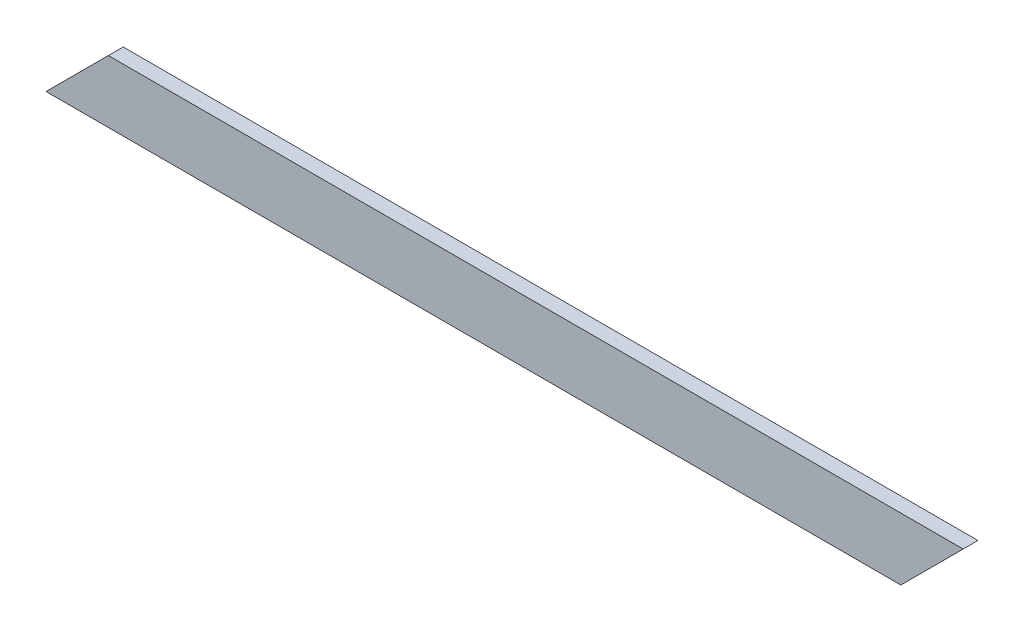
ISO-10303-21;
HEADER;
FILE_DESCRIPTION(('STEP AP214'),'2;1');
FILE_NAME('part.step','',(''),(''),'','','');
FILE_SCHEMA(('AUTOMOTIVE_DESIGN { 1 0 10303 214 1 1 1 1 }'));
ENDSEC;
DATA;
#1=APPLICATION_CONTEXT('core data for automotive mechanical design processes');
#2=APPLICATION_PROTOCOL_DEFINITION('international standard','automotive_design',2000,#1);
#3=PRODUCT_CONTEXT('',#1,'mechanical');
#4=PRODUCT('Part','Part','',(#3));
#5=PRODUCT_RELATED_PRODUCT_CATEGORY('part','',(#4));
#6=PRODUCT_DEFINITION_FORMATION('','',#4);
#7=PRODUCT_DEFINITION_CONTEXT('part definition',#1,'design');
#8=PRODUCT_DEFINITION('design','',#6,#7);
#9=PRODUCT_DEFINITION_SHAPE('','',#8);
#10=(LENGTH_UNIT() NAMED_UNIT(*) SI_UNIT(.MILLI.,.METRE.));
#11=(NAMED_UNIT(*) PLANE_ANGLE_UNIT() SI_UNIT($,.RADIAN.));
#12=(NAMED_UNIT(*) SI_UNIT($,.STERADIAN.) SOLID_ANGLE_UNIT());
#13=UNCERTAINTY_MEASURE_WITH_UNIT(LENGTH_MEASURE(1.E-05),#10,'distance_accuracy_value','');
#14=(GEOMETRIC_REPRESENTATION_CONTEXT(3) GLOBAL_UNCERTAINTY_ASSIGNED_CONTEXT((#13)) GLOBAL_UNIT_ASSIGNED_CONTEXT((#10,
#11,#12)) REPRESENTATION_CONTEXT('',''));
#15=CARTESIAN_POINT('',(0.,0.,0.));
#16=DIRECTION('',(0.,0.,1.));
#17=DIRECTION('',(1.,0.,0.));
#18=AXIS2_PLACEMENT_3D('',#15,#16,#17);
#19=CARTESIAN_POINT('',(266.699999911679,266.699999911679,63.5));
#20=DIRECTION('',(0.707106781186547,-0.707106781186548,0.));
#21=DIRECTION('',(0.707106781186548,0.707106781186547,0.));
#22=AXIS2_PLACEMENT_3D('',#19,#20,#21);
#23=PLANE('',#22);
#24=DIRECTION('',(-0.707106781186548,-0.707106781186547,0.));
#25=VECTOR('',#24,1.);
#26=CARTESIAN_POINT('',(266.699999911679,266.699999911679,0.));
#27=LINE('',#26,#25);
#28=CARTESIAN_POINT('',(266.699999911679,266.699999911679,0.));
#29=VERTEX_POINT('',#28);
#30=CARTESIAN_POINT('',(0.,0.,0.));
#31=VERTEX_POINT('',#30);
#32=EDGE_CURVE('E95',#29,#31,#27,.T.);
#33=ORIENTED_EDGE('',*,*,#32,.T.);
#34=DIRECTION('',(0.,0.,-1.));
#35=VECTOR('',#34,1.);
#36=CARTESIAN_POINT('',(0.,0.,63.5));
#37=LINE('',#36,#35);
#38=CARTESIAN_POINT('',(0.,0.,63.5));
#39=VERTEX_POINT('',#38);
#40=EDGE_CURVE('E11',#39,#31,#37,.T.);
#41=ORIENTED_EDGE('',*,*,#40,.F.);
#42=DIRECTION('',(-0.707106781186548,-0.707106781186547,0.));
#43=VECTOR('',#42,1.);
#44=CARTESIAN_POINT('',(266.699999911679,266.699999911679,63.5));
#45=LINE('',#44,#43);
#46=CARTESIAN_POINT('',(266.699999911679,266.699999911679,63.5));
#47=VERTEX_POINT('',#46);
#48=EDGE_CURVE('E83',#47,#39,#45,.T.);
#49=ORIENTED_EDGE('',*,*,#48,.F.);
#50=DIRECTION('',(0.,0.,-1.));
#51=VECTOR('',#50,1.);
#52=CARTESIAN_POINT('',(266.699999911679,266.699999911679,63.5));
#53=LINE('',#52,#51);
#54=EDGE_CURVE('E91',#47,#29,#53,.T.);
#55=ORIENTED_EDGE('',*,*,#54,.T.);
#56=EDGE_LOOP('',(#33,#41,#49,#55));
#57=FACE_BOUND('',#56,.T.);
#58=ADVANCED_FACE('F32',(#57),#23,.F.);
#59=CARTESIAN_POINT('',(0.,0.,63.5));
#60=DIRECTION('',(0.,1.,0.));
#61=DIRECTION('',(0.,0.,1.));
#62=AXIS2_PLACEMENT_3D('',#59,#60,#61);
#63=PLANE('',#62);
#64=DIRECTION('',(1.,0.,0.));
#65=VECTOR('',#64,1.);
#66=CARTESIAN_POINT('',(0.,0.,0.));
#67=LINE('',#66,#65);
#68=CARTESIAN_POINT('',(3657.6,0.,0.));
#69=VERTEX_POINT('',#68);
#70=EDGE_CURVE('E87',#31,#69,#67,.T.);
#71=ORIENTED_EDGE('',*,*,#70,.T.);
#72=DIRECTION('',(0.,0.,-1.));
#73=VECTOR('',#72,1.);
#74=CARTESIAN_POINT('',(3657.6,0.,63.5));
#75=LINE('',#74,#73);
#76=CARTESIAN_POINT('',(3657.6,0.,63.5));
#77=VERTEX_POINT('',#76);
#78=EDGE_CURVE('E40',#77,#69,#75,.T.);
#79=ORIENTED_EDGE('',*,*,#78,.F.);
#80=DIRECTION('',(1.,0.,0.));
#81=VECTOR('',#80,1.);
#82=CARTESIAN_POINT('',(0.,0.,63.5));
#83=LINE('',#82,#81);
#84=EDGE_CURVE('E78',#39,#77,#83,.T.);
#85=ORIENTED_EDGE('',*,*,#84,.F.);
#86=ORIENTED_EDGE('',*,*,#40,.T.);
#87=EDGE_LOOP('',(#71,#79,#85,#86));
#88=FACE_BOUND('',#87,.T.);
#89=ADVANCED_FACE('F86',(#88),#63,.F.);
#90=CARTESIAN_POINT('',(3657.6,0.,63.5));
#91=DIRECTION('',(-0.707106781186548,0.707106781186547,0.));
#92=DIRECTION('',(-0.707106781186547,-0.707106781186548,0.));
#93=AXIS2_PLACEMENT_3D('',#90,#91,#92);
#94=PLANE('',#93);
#95=DIRECTION('',(0.707106781186547,0.707106781186548,0.));
#96=VECTOR('',#95,1.);
#97=CARTESIAN_POINT('',(3657.6,0.,0.));
#98=LINE('',#97,#96);
#99=CARTESIAN_POINT('',(3924.29999991168,266.699999911679,0.));
#100=VERTEX_POINT('',#99);
#101=EDGE_CURVE('E65',#69,#100,#98,.T.);
#102=ORIENTED_EDGE('',*,*,#101,.T.);
#103=DIRECTION('',(0.,0.,-1.));
#104=VECTOR('',#103,1.);
#105=CARTESIAN_POINT('',(3924.29999991168,266.699999911679,63.5));
#106=LINE('',#105,#104);
#107=CARTESIAN_POINT('',(3924.29999991168,266.699999911679,63.5));
#108=VERTEX_POINT('',#107);
#109=EDGE_CURVE('E88',#108,#100,#106,.T.);
#110=ORIENTED_EDGE('',*,*,#109,.F.);
#111=DIRECTION('',(0.707106781186547,0.707106781186548,0.));
#112=VECTOR('',#111,1.);
#113=CARTESIAN_POINT('',(3657.6,0.,63.5));
#114=LINE('',#113,#112);
#115=EDGE_CURVE('E81',#77,#108,#114,.T.);
#116=ORIENTED_EDGE('',*,*,#115,.F.);
#117=ORIENTED_EDGE('',*,*,#78,.T.);
#118=EDGE_LOOP('',(#102,#110,#116,#117));
#119=FACE_BOUND('',#118,.T.);
#120=ADVANCED_FACE('F89',(#119),#94,.F.);
#121=CARTESIAN_POINT('',(3924.29999991168,266.699999911679,63.5));
#122=DIRECTION('',(0.,-1.,0.));
#123=DIRECTION('',(1.,0.,0.));
#124=AXIS2_PLACEMENT_3D('',#121,#122,#123);
#125=PLANE('',#124);
#126=DIRECTION('',(-1.,0.,0.));
#127=VECTOR('',#126,1.);
#128=CARTESIAN_POINT('',(3924.29999991168,266.699999911679,0.));
#129=LINE('',#128,#127);
#130=EDGE_CURVE('E71',#100,#29,#129,.T.);
#131=ORIENTED_EDGE('',*,*,#130,.T.);
#132=ORIENTED_EDGE('',*,*,#54,.F.);
#133=DIRECTION('',(-1.,0.,0.));
#134=VECTOR('',#133,1.);
#135=CARTESIAN_POINT('',(3924.29999991168,266.699999911679,63.5));
#136=LINE('',#135,#134);
#137=EDGE_CURVE('E48',#108,#47,#136,.T.);
#138=ORIENTED_EDGE('',*,*,#137,.F.);
#139=ORIENTED_EDGE('',*,*,#109,.T.);
#140=EDGE_LOOP('',(#131,#132,#138,#139));
#141=FACE_BOUND('',#140,.T.);
#142=ADVANCED_FACE('F102',(#141),#125,.F.);
#143=CARTESIAN_POINT('',(0.,0.,63.5));
#144=DIRECTION('',(0.,0.,1.));
#145=DIRECTION('',(1.,0.,0.));
#146=AXIS2_PLACEMENT_3D('',#143,#144,#145);
#147=PLANE('',#146);
#148=ORIENTED_EDGE('',*,*,#48,.T.);
#149=ORIENTED_EDGE('',*,*,#84,.T.);
#150=ORIENTED_EDGE('',*,*,#115,.T.);
#151=ORIENTED_EDGE('',*,*,#137,.T.);
#152=EDGE_LOOP('',(#148,#149,#150,#151));
#153=FACE_BOUND('',#152,.T.);
#154=ADVANCED_FACE('F79',(#153),#147,.T.);
#155=CARTESIAN_POINT('',(0.,0.,0.));
#156=DIRECTION('',(0.,0.,1.));
#157=DIRECTION('',(1.,0.,0.));
#158=AXIS2_PLACEMENT_3D('',#155,#156,#157);
#159=PLANE('',#158);
#160=ORIENTED_EDGE('',*,*,#32,.F.);
#161=ORIENTED_EDGE('',*,*,#130,.F.);
#162=ORIENTED_EDGE('',*,*,#101,.F.);
#163=ORIENTED_EDGE('',*,*,#70,.F.);
#164=EDGE_LOOP('',(#160,#161,#162,#163));
#165=FACE_BOUND('',#164,.T.);
#166=ADVANCED_FACE('F105',(#165),#159,.F.);
#167=CLOSED_SHELL('',(#58,#89,#120,#142,#154,#166));
#168=MANIFOLD_SOLID_BREP('B2',#167);
#169=ADVANCED_BREP_SHAPE_REPRESENTATION('',(#18,#168),#14);
#170=SHAPE_DEFINITION_REPRESENTATION(#9,#169);
ENDSEC;
END-ISO-10303-21;
